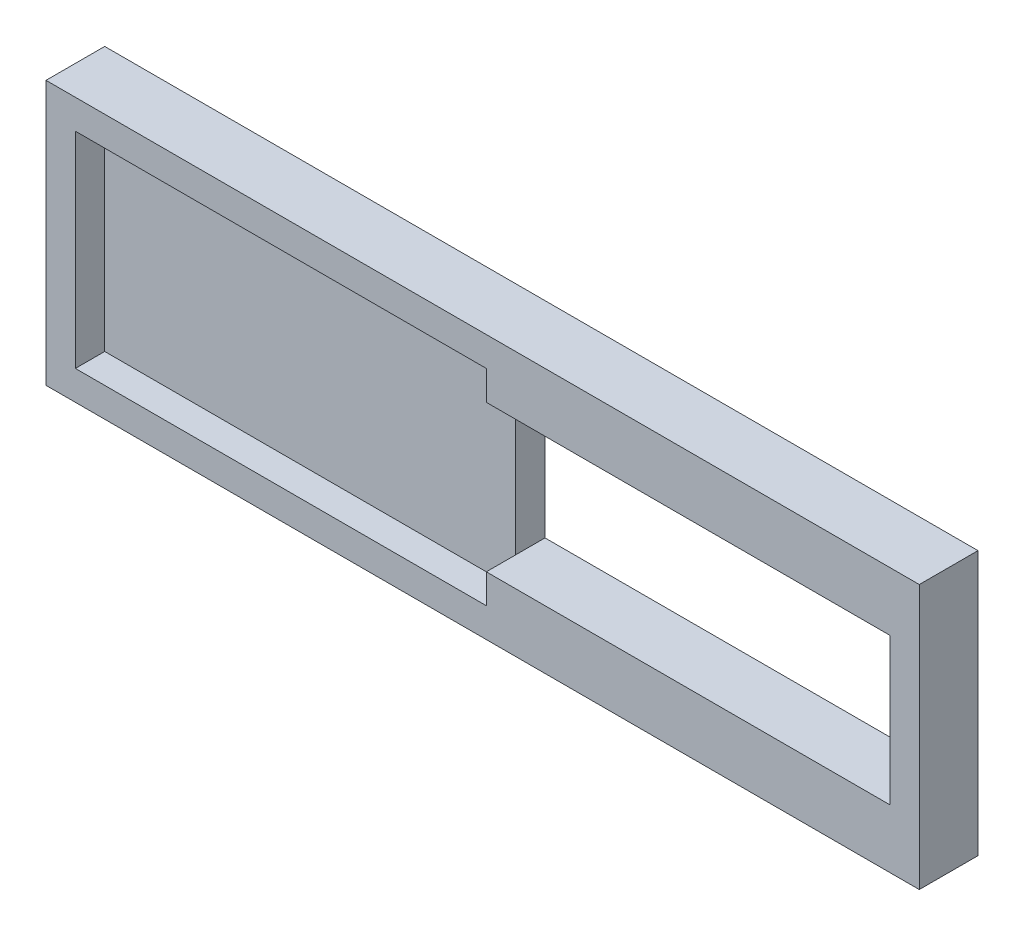
ISO-10303-21;
HEADER;
FILE_DESCRIPTION(('STEP AP214'),'2;1');
FILE_NAME('part.step','',(''),(''),'','','');
FILE_SCHEMA(('AUTOMOTIVE_DESIGN { 1 0 10303 214 1 1 1 1 }'));
ENDSEC;
DATA;
#1=APPLICATION_CONTEXT('core data for automotive mechanical design processes');
#2=APPLICATION_PROTOCOL_DEFINITION('international standard','automotive_design',2000,#1);
#3=PRODUCT_CONTEXT('',#1,'mechanical');
#4=PRODUCT('Part','Part','',(#3));
#5=PRODUCT_RELATED_PRODUCT_CATEGORY('part','',(#4));
#6=PRODUCT_DEFINITION_FORMATION('','',#4);
#7=PRODUCT_DEFINITION_CONTEXT('part definition',#1,'design');
#8=PRODUCT_DEFINITION('design','',#6,#7);
#9=PRODUCT_DEFINITION_SHAPE('','',#8);
#10=(LENGTH_UNIT() NAMED_UNIT(*) SI_UNIT(.MILLI.,.METRE.));
#11=(NAMED_UNIT(*) PLANE_ANGLE_UNIT() SI_UNIT($,.RADIAN.));
#12=(NAMED_UNIT(*) SI_UNIT($,.STERADIAN.) SOLID_ANGLE_UNIT());
#13=UNCERTAINTY_MEASURE_WITH_UNIT(LENGTH_MEASURE(1.E-05),#10,'distance_accuracy_value','');
#14=(GEOMETRIC_REPRESENTATION_CONTEXT(3) GLOBAL_UNCERTAINTY_ASSIGNED_CONTEXT((#13)) GLOBAL_UNIT_ASSIGNED_CONTEXT((#10,
#11,#12)) REPRESENTATION_CONTEXT('',''));
#15=CARTESIAN_POINT('',(0.,0.,0.));
#16=DIRECTION('',(0.,0.,1.));
#17=DIRECTION('',(1.,0.,0.));
#18=AXIS2_PLACEMENT_3D('',#15,#16,#17);
#19=CARTESIAN_POINT('',(0.,0.,5.08));
#20=DIRECTION('',(0.,0.,-1.));
#21=DIRECTION('',(-1.,0.,0.));
#22=AXIS2_PLACEMENT_3D('',#19,#20,#21);
#23=PLANE('',#22);
#24=DIRECTION('',(0.,1.,0.));
#25=VECTOR('',#24,1.);
#26=CARTESIAN_POINT('',(37.7825,-11.43,5.08));
#27=LINE('',#26,#25);
#28=CARTESIAN_POINT('',(37.7825,-11.43,5.08));
#29=VERTEX_POINT('',#28);
#30=CARTESIAN_POINT('',(37.7825,11.43,5.08));
#31=VERTEX_POINT('',#30);
#32=EDGE_CURVE('E202',#29,#31,#27,.T.);
#33=ORIENTED_EDGE('',*,*,#32,.T.);
#34=DIRECTION('',(-1.,0.,0.));
#35=VECTOR('',#34,1.);
#36=CARTESIAN_POINT('',(-37.7825,11.43,5.08));
#37=LINE('',#36,#35);
#38=CARTESIAN_POINT('',(-37.7825,11.43,5.08));
#39=VERTEX_POINT('',#38);
#40=EDGE_CURVE('E205',#31,#39,#37,.T.);
#41=ORIENTED_EDGE('',*,*,#40,.T.);
#42=DIRECTION('',(0.,-1.,0.));
#43=VECTOR('',#42,1.);
#44=CARTESIAN_POINT('',(-37.7825,-11.43,5.08));
#45=LINE('',#44,#43);
#46=CARTESIAN_POINT('',(-37.7825,-11.43,5.08));
#47=VERTEX_POINT('',#46);
#48=EDGE_CURVE('E208',#39,#47,#45,.T.);
#49=ORIENTED_EDGE('',*,*,#48,.T.);
#50=DIRECTION('',(1.,0.,0.));
#51=VECTOR('',#50,1.);
#52=CARTESIAN_POINT('',(-37.7825,-11.43,5.08));
#53=LINE('',#52,#51);
#54=EDGE_CURVE('E210',#47,#29,#53,.T.);
#55=ORIENTED_EDGE('',*,*,#54,.T.);
#56=EDGE_LOOP('',(#33,#41,#49,#55));
#57=FACE_BOUND('',#56,.T.);
#58=DIRECTION('',(-1.,0.,0.));
#59=VECTOR('',#58,1.);
#60=CARTESIAN_POINT('',(35.2425,-6.35,5.08));
#61=LINE('',#60,#59);
#62=CARTESIAN_POINT('',(35.2425,-6.35,5.08));
#63=VERTEX_POINT('',#62);
#64=CARTESIAN_POINT('',(0.317500000000012,-6.35,5.08));
#65=VERTEX_POINT('',#64);
#66=EDGE_CURVE('E147',#63,#65,#61,.T.);
#67=ORIENTED_EDGE('',*,*,#66,.T.);
#68=DIRECTION('',(0.,1.,0.));
#69=VECTOR('',#68,1.);
#70=CARTESIAN_POINT('',(0.317499999999998,8.89,5.08));
#71=LINE('',#70,#69);
#72=CARTESIAN_POINT('',(0.317499999999998,-8.89,5.08));
#73=VERTEX_POINT('',#72);
#74=EDGE_CURVE('E187',#73,#65,#71,.T.);
#75=ORIENTED_EDGE('',*,*,#74,.F.);
#76=DIRECTION('',(1.,0.,0.));
#77=VECTOR('',#76,1.);
#78=CARTESIAN_POINT('',(-35.2425,-8.89,5.08));
#79=LINE('',#78,#77);
#80=CARTESIAN_POINT('',(-35.2425,-8.89,5.08));
#81=VERTEX_POINT('',#80);
#82=EDGE_CURVE('E183',#81,#73,#79,.T.);
#83=ORIENTED_EDGE('',*,*,#82,.F.);
#84=DIRECTION('',(0.,-1.,0.));
#85=VECTOR('',#84,1.);
#86=CARTESIAN_POINT('',(-35.2425,8.89,5.08));
#87=LINE('',#86,#85);
#88=CARTESIAN_POINT('',(-35.2425,8.89,5.08));
#89=VERTEX_POINT('',#88);
#90=EDGE_CURVE('E148',#89,#81,#87,.T.);
#91=ORIENTED_EDGE('',*,*,#90,.F.);
#92=DIRECTION('',(-1.,0.,0.));
#93=VECTOR('',#92,1.);
#94=CARTESIAN_POINT('',(-35.2425,8.89,5.08));
#95=LINE('',#94,#93);
#96=CARTESIAN_POINT('',(0.317499999999998,8.89,5.08));
#97=VERTEX_POINT('',#96);
#98=EDGE_CURVE('E170',#97,#89,#95,.T.);
#99=ORIENTED_EDGE('',*,*,#98,.F.);
#100=CARTESIAN_POINT('',(0.317500000000012,6.35,5.08));
#101=VERTEX_POINT('',#100);
#102=EDGE_CURVE('E186',#101,#97,#71,.T.);
#103=ORIENTED_EDGE('',*,*,#102,.F.);
#104=DIRECTION('',(-1.,0.,0.));
#105=VECTOR('',#104,1.);
#106=CARTESIAN_POINT('',(35.2425,6.35,5.08));
#107=LINE('',#106,#105);
#108=CARTESIAN_POINT('',(35.2425,6.35,5.08));
#109=VERTEX_POINT('',#108);
#110=EDGE_CURVE('E141',#109,#101,#107,.T.);
#111=ORIENTED_EDGE('',*,*,#110,.F.);
#112=DIRECTION('',(0.,-1.,0.));
#113=VECTOR('',#112,1.);
#114=CARTESIAN_POINT('',(35.2425,6.35,5.08));
#115=LINE('',#114,#113);
#116=EDGE_CURVE('E157',#109,#63,#115,.T.);
#117=ORIENTED_EDGE('',*,*,#116,.T.);
#118=EDGE_LOOP('',(#67,#75,#83,#91,#99,#103,#111,#117));
#119=FACE_BOUND('',#118,.T.);
#120=ADVANCED_FACE('F35',(#57,#119),#23,.F.);
#121=CARTESIAN_POINT('',(0.,0.,0.));
#122=DIRECTION('',(0.,0.,-1.));
#123=DIRECTION('',(-1.,0.,0.));
#124=AXIS2_PLACEMENT_3D('',#121,#122,#123);
#125=PLANE('',#124);
#126=DIRECTION('',(0.,1.,0.));
#127=VECTOR('',#126,1.);
#128=CARTESIAN_POINT('',(37.7825,-11.43,0.));
#129=LINE('',#128,#127);
#130=CARTESIAN_POINT('',(37.7825,-11.43,0.));
#131=VERTEX_POINT('',#130);
#132=CARTESIAN_POINT('',(37.7825,11.43,0.));
#133=VERTEX_POINT('',#132);
#134=EDGE_CURVE('E194',#131,#133,#129,.T.);
#135=ORIENTED_EDGE('',*,*,#134,.F.);
#136=DIRECTION('',(1.,0.,0.));
#137=VECTOR('',#136,1.);
#138=CARTESIAN_POINT('',(-37.7825,-11.43,0.));
#139=LINE('',#138,#137);
#140=CARTESIAN_POINT('',(-37.7825,-11.43,0.));
#141=VERTEX_POINT('',#140);
#142=EDGE_CURVE('E206',#141,#131,#139,.T.);
#143=ORIENTED_EDGE('',*,*,#142,.F.);
#144=DIRECTION('',(0.,-1.,0.));
#145=VECTOR('',#144,1.);
#146=CARTESIAN_POINT('',(-37.7825,-11.43,0.));
#147=LINE('',#146,#145);
#148=CARTESIAN_POINT('',(-37.7825,11.43,0.));
#149=VERTEX_POINT('',#148);
#150=EDGE_CURVE('E217',#149,#141,#147,.T.);
#151=ORIENTED_EDGE('',*,*,#150,.F.);
#152=DIRECTION('',(-1.,0.,0.));
#153=VECTOR('',#152,1.);
#154=CARTESIAN_POINT('',(-37.7825,11.43,0.));
#155=LINE('',#154,#153);
#156=EDGE_CURVE('E215',#133,#149,#155,.T.);
#157=ORIENTED_EDGE('',*,*,#156,.F.);
#158=EDGE_LOOP('',(#135,#143,#151,#157));
#159=FACE_BOUND('',#158,.T.);
#160=DIRECTION('',(-1.,0.,0.));
#161=VECTOR('',#160,1.);
#162=CARTESIAN_POINT('',(35.2425,-6.35,0.));
#163=LINE('',#162,#161);
#164=CARTESIAN_POINT('',(35.2425,-6.35,0.));
#165=VERTEX_POINT('',#164);
#166=CARTESIAN_POINT('',(0.317500000000012,-6.35,0.));
#167=VERTEX_POINT('',#166);
#168=EDGE_CURVE('E140',#165,#167,#163,.T.);
#169=ORIENTED_EDGE('',*,*,#168,.F.);
#170=DIRECTION('',(0.,-1.,0.));
#171=VECTOR('',#170,1.);
#172=CARTESIAN_POINT('',(35.2425,6.35,0.));
#173=LINE('',#172,#171);
#174=CARTESIAN_POINT('',(35.2425,6.35,0.));
#175=VERTEX_POINT('',#174);
#176=EDGE_CURVE('E129',#175,#165,#173,.T.);
#177=ORIENTED_EDGE('',*,*,#176,.F.);
#178=DIRECTION('',(-1.,0.,0.));
#179=VECTOR('',#178,1.);
#180=CARTESIAN_POINT('',(35.2425,6.35,0.));
#181=LINE('',#180,#179);
#182=CARTESIAN_POINT('',(0.317500000000012,6.35,0.));
#183=VERTEX_POINT('',#182);
#184=EDGE_CURVE('E153',#175,#183,#181,.T.);
#185=ORIENTED_EDGE('',*,*,#184,.T.);
#186=DIRECTION('',(0.,-1.,0.));
#187=VECTOR('',#186,1.);
#188=CARTESIAN_POINT('',(0.317500000000012,6.35,0.));
#189=LINE('',#188,#187);
#190=EDGE_CURVE('E50',#183,#167,#189,.T.);
#191=ORIENTED_EDGE('',*,*,#190,.T.);
#192=EDGE_LOOP('',(#169,#177,#185,#191));
#193=FACE_BOUND('',#192,.T.);
#194=ADVANCED_FACE('F151',(#159,#193),#125,.T.);
#195=CARTESIAN_POINT('',(0.317499999999998,8.89,2.54));
#196=DIRECTION('',(1.,0.,0.));
#197=DIRECTION('',(0.,0.,-1.));
#198=AXIS2_PLACEMENT_3D('',#195,#196,#197);
#199=PLANE('',#198);
#200=DIRECTION('',(0.,0.,1.));
#201=VECTOR('',#200,1.);
#202=CARTESIAN_POINT('',(0.317500000000012,-6.35,0.));
#203=LINE('',#202,#201);
#204=CARTESIAN_POINT('',(0.317500000000012,-6.35,2.54));
#205=VERTEX_POINT('',#204);
#206=EDGE_CURVE('E164',#205,#65,#203,.T.);
#207=ORIENTED_EDGE('',*,*,#206,.F.);
#208=DIRECTION('',(0.,1.,0.));
#209=VECTOR('',#208,1.);
#210=CARTESIAN_POINT('',(0.317499999999998,8.89,2.54));
#211=LINE('',#210,#209);
#212=CARTESIAN_POINT('',(0.317499999999998,-8.89,2.54));
#213=VERTEX_POINT('',#212);
#214=EDGE_CURVE('E174',#213,#205,#211,.T.);
#215=ORIENTED_EDGE('',*,*,#214,.F.);
#216=DIRECTION('',(0.,0.,1.));
#217=VECTOR('',#216,1.);
#218=CARTESIAN_POINT('',(0.317499999999998,-8.89,2.54));
#219=LINE('',#218,#217);
#220=EDGE_CURVE('E198',#213,#73,#219,.T.);
#221=ORIENTED_EDGE('',*,*,#220,.T.);
#222=ORIENTED_EDGE('',*,*,#74,.T.);
#223=EDGE_LOOP('',(#207,#215,#221,#222));
#224=FACE_BOUND('',#223,.T.);
#225=ADVANCED_FACE('F251',(#224),#199,.F.);
#226=CARTESIAN_POINT('',(37.7825,-11.43,5.08));
#227=DIRECTION('',(-1.,0.,0.));
#228=DIRECTION('',(0.,0.,1.));
#229=AXIS2_PLACEMENT_3D('',#226,#227,#228);
#230=PLANE('',#229);
#231=ORIENTED_EDGE('',*,*,#134,.T.);
#232=DIRECTION('',(0.,0.,-1.));
#233=VECTOR('',#232,1.);
#234=CARTESIAN_POINT('',(37.7825,11.43,5.08));
#235=LINE('',#234,#233);
#236=EDGE_CURVE('E11',#31,#133,#235,.T.);
#237=ORIENTED_EDGE('',*,*,#236,.F.);
#238=ORIENTED_EDGE('',*,*,#32,.F.);
#239=DIRECTION('',(0.,0.,-1.));
#240=VECTOR('',#239,1.);
#241=CARTESIAN_POINT('',(37.7825,-11.43,5.08));
#242=LINE('',#241,#240);
#243=EDGE_CURVE('E212',#29,#131,#242,.T.);
#244=ORIENTED_EDGE('',*,*,#243,.T.);
#245=EDGE_LOOP('',(#231,#237,#238,#244));
#246=FACE_BOUND('',#245,.T.);
#247=ADVANCED_FACE('F37',(#246),#230,.F.);
#248=CARTESIAN_POINT('',(-37.7825,11.43,5.08));
#249=DIRECTION('',(0.,-1.,0.));
#250=DIRECTION('',(0.,0.,-1.));
#251=AXIS2_PLACEMENT_3D('',#248,#249,#250);
#252=PLANE('',#251);
#253=ORIENTED_EDGE('',*,*,#156,.T.);
#254=DIRECTION('',(0.,0.,-1.));
#255=VECTOR('',#254,1.);
#256=CARTESIAN_POINT('',(-37.7825,11.43,5.08));
#257=LINE('',#256,#255);
#258=EDGE_CURVE('E43',#39,#149,#257,.T.);
#259=ORIENTED_EDGE('',*,*,#258,.F.);
#260=ORIENTED_EDGE('',*,*,#40,.F.);
#261=ORIENTED_EDGE('',*,*,#236,.T.);
#262=EDGE_LOOP('',(#253,#259,#260,#261));
#263=FACE_BOUND('',#262,.T.);
#264=ADVANCED_FACE('F244',(#263),#252,.F.);
#265=CARTESIAN_POINT('',(-37.7825,-11.43,5.08));
#266=DIRECTION('',(1.,0.,0.));
#267=DIRECTION('',(0.,0.,-1.));
#268=AXIS2_PLACEMENT_3D('',#265,#266,#267);
#269=PLANE('',#268);
#270=ORIENTED_EDGE('',*,*,#150,.T.);
#271=DIRECTION('',(0.,0.,-1.));
#272=VECTOR('',#271,1.);
#273=CARTESIAN_POINT('',(-37.7825,-11.43,5.08));
#274=LINE('',#273,#272);
#275=EDGE_CURVE('E222',#47,#141,#274,.T.);
#276=ORIENTED_EDGE('',*,*,#275,.F.);
#277=ORIENTED_EDGE('',*,*,#48,.F.);
#278=ORIENTED_EDGE('',*,*,#258,.T.);
#279=EDGE_LOOP('',(#270,#276,#277,#278));
#280=FACE_BOUND('',#279,.T.);
#281=ADVANCED_FACE('F229',(#280),#269,.F.);
#282=CARTESIAN_POINT('',(-37.7825,-11.43,5.08));
#283=DIRECTION('',(0.,1.,0.));
#284=DIRECTION('',(0.,0.,1.));
#285=AXIS2_PLACEMENT_3D('',#282,#283,#284);
#286=PLANE('',#285);
#287=ORIENTED_EDGE('',*,*,#142,.T.);
#288=ORIENTED_EDGE('',*,*,#243,.F.);
#289=ORIENTED_EDGE('',*,*,#54,.F.);
#290=ORIENTED_EDGE('',*,*,#275,.T.);
#291=EDGE_LOOP('',(#287,#288,#289,#290));
#292=FACE_BOUND('',#291,.T.);
#293=ADVANCED_FACE('F237',(#292),#286,.F.);
#294=CARTESIAN_POINT('',(-35.2425,8.89,2.54));
#295=DIRECTION('',(-1.,0.,0.));
#296=DIRECTION('',(0.,0.,1.));
#297=AXIS2_PLACEMENT_3D('',#294,#295,#296);
#298=PLANE('',#297);
#299=ORIENTED_EDGE('',*,*,#90,.T.);
#300=DIRECTION('',(0.,0.,1.));
#301=VECTOR('',#300,1.);
#302=CARTESIAN_POINT('',(-35.2425,-8.89,2.54));
#303=LINE('',#302,#301);
#304=CARTESIAN_POINT('',(-35.2425,-8.89,2.54));
#305=VERTEX_POINT('',#304);
#306=EDGE_CURVE('E181',#305,#81,#303,.T.);
#307=ORIENTED_EDGE('',*,*,#306,.F.);
#308=DIRECTION('',(0.,-1.,0.));
#309=VECTOR('',#308,1.);
#310=CARTESIAN_POINT('',(-35.2425,8.89,2.54));
#311=LINE('',#310,#309);
#312=CARTESIAN_POINT('',(-35.2425,8.89,2.54));
#313=VERTEX_POINT('',#312);
#314=EDGE_CURVE('E166',#313,#305,#311,.T.);
#315=ORIENTED_EDGE('',*,*,#314,.F.);
#316=DIRECTION('',(0.,0.,1.));
#317=VECTOR('',#316,1.);
#318=CARTESIAN_POINT('',(-35.2425,8.89,2.54));
#319=LINE('',#318,#317);
#320=EDGE_CURVE('E192',#313,#89,#319,.T.);
#321=ORIENTED_EDGE('',*,*,#320,.T.);
#322=EDGE_LOOP('',(#299,#307,#315,#321));
#323=FACE_BOUND('',#322,.T.);
#324=ADVANCED_FACE('F259',(#323),#298,.F.);
#325=CARTESIAN_POINT('',(-35.2425,8.89,2.54));
#326=DIRECTION('',(0.,1.,0.));
#327=DIRECTION('',(0.,0.,1.));
#328=AXIS2_PLACEMENT_3D('',#325,#326,#327);
#329=PLANE('',#328);
#330=ORIENTED_EDGE('',*,*,#98,.T.);
#331=ORIENTED_EDGE('',*,*,#320,.F.);
#332=DIRECTION('',(-1.,0.,0.));
#333=VECTOR('',#332,1.);
#334=CARTESIAN_POINT('',(-35.2425,8.89,2.54));
#335=LINE('',#334,#333);
#336=CARTESIAN_POINT('',(0.317499999999998,8.89,2.54));
#337=VERTEX_POINT('',#336);
#338=EDGE_CURVE('E177',#337,#313,#335,.T.);
#339=ORIENTED_EDGE('',*,*,#338,.F.);
#340=DIRECTION('',(0.,0.,1.));
#341=VECTOR('',#340,1.);
#342=CARTESIAN_POINT('',(0.317499999999998,8.89,2.54));
#343=LINE('',#342,#341);
#344=EDGE_CURVE('E195',#337,#97,#343,.T.);
#345=ORIENTED_EDGE('',*,*,#344,.T.);
#346=EDGE_LOOP('',(#330,#331,#339,#345));
#347=FACE_BOUND('',#346,.T.);
#348=ADVANCED_FACE('F266',(#347),#329,.F.);
#349=CARTESIAN_POINT('',(0.317499999999998,6.35,2.54));
#350=VERTEX_POINT('',#349);
#351=EDGE_CURVE('E173',#350,#337,#211,.T.);
#352=ORIENTED_EDGE('',*,*,#351,.F.);
#353=DIRECTION('',(0.,0.,1.));
#354=VECTOR('',#353,1.);
#355=CARTESIAN_POINT('',(0.317500000000012,6.35,0.));
#356=LINE('',#355,#354);
#357=EDGE_CURVE('E162',#350,#101,#356,.T.);
#358=ORIENTED_EDGE('',*,*,#357,.T.);
#359=ORIENTED_EDGE('',*,*,#102,.T.);
#360=ORIENTED_EDGE('',*,*,#344,.F.);
#361=EDGE_LOOP('',(#352,#358,#359,#360));
#362=FACE_BOUND('',#361,.T.);
#363=ADVANCED_FACE('F271',(#362),#199,.F.);
#364=CARTESIAN_POINT('',(-35.2425,-8.89,2.54));
#365=DIRECTION('',(0.,-1.,0.));
#366=DIRECTION('',(0.,0.,-1.));
#367=AXIS2_PLACEMENT_3D('',#364,#365,#366);
#368=PLANE('',#367);
#369=ORIENTED_EDGE('',*,*,#82,.T.);
#370=ORIENTED_EDGE('',*,*,#220,.F.);
#371=DIRECTION('',(1.,0.,0.));
#372=VECTOR('',#371,1.);
#373=CARTESIAN_POINT('',(-35.2425,-8.89,2.54));
#374=LINE('',#373,#372);
#375=EDGE_CURVE('E169',#305,#213,#374,.T.);
#376=ORIENTED_EDGE('',*,*,#375,.F.);
#377=ORIENTED_EDGE('',*,*,#306,.T.);
#378=EDGE_LOOP('',(#369,#370,#376,#377));
#379=FACE_BOUND('',#378,.T.);
#380=ADVANCED_FACE('F280',(#379),#368,.F.);
#381=CARTESIAN_POINT('',(0.,0.,2.54));
#382=DIRECTION('',(0.,0.,1.));
#383=DIRECTION('',(1.,0.,0.));
#384=AXIS2_PLACEMENT_3D('',#381,#382,#383);
#385=PLANE('',#384);
#386=ORIENTED_EDGE('',*,*,#314,.T.);
#387=ORIENTED_EDGE('',*,*,#375,.T.);
#388=ORIENTED_EDGE('',*,*,#214,.T.);
#389=EDGE_CURVE('E178',#205,#350,#211,.T.);
#390=ORIENTED_EDGE('',*,*,#389,.T.);
#391=ORIENTED_EDGE('',*,*,#351,.T.);
#392=ORIENTED_EDGE('',*,*,#338,.T.);
#393=EDGE_LOOP('',(#386,#387,#388,#390,#391,#392));
#394=FACE_BOUND('',#393,.T.);
#395=ADVANCED_FACE('F287',(#394),#385,.T.);
#396=CARTESIAN_POINT('',(35.2425,6.35,0.));
#397=DIRECTION('',(-1.,0.,0.));
#398=DIRECTION('',(0.,0.,1.));
#399=AXIS2_PLACEMENT_3D('',#396,#397,#398);
#400=PLANE('',#399);
#401=ORIENTED_EDGE('',*,*,#116,.F.);
#402=DIRECTION('',(0.,0.,1.));
#403=VECTOR('',#402,1.);
#404=CARTESIAN_POINT('',(35.2425,6.35,0.));
#405=LINE('',#404,#403);
#406=EDGE_CURVE('E135',#175,#109,#405,.T.);
#407=ORIENTED_EDGE('',*,*,#406,.F.);
#408=ORIENTED_EDGE('',*,*,#176,.T.);
#409=DIRECTION('',(0.,0.,1.));
#410=VECTOR('',#409,1.);
#411=CARTESIAN_POINT('',(35.2425,-6.35,0.));
#412=LINE('',#411,#410);
#413=EDGE_CURVE('E133',#165,#63,#412,.T.);
#414=ORIENTED_EDGE('',*,*,#413,.T.);
#415=EDGE_LOOP('',(#401,#407,#408,#414));
#416=FACE_BOUND('',#415,.T.);
#417=ADVANCED_FACE('F132',(#416),#400,.T.);
#418=CARTESIAN_POINT('',(35.2425,-6.35,0.));
#419=DIRECTION('',(0.,1.,0.));
#420=DIRECTION('',(-1.,0.,0.));
#421=AXIS2_PLACEMENT_3D('',#418,#419,#420);
#422=PLANE('',#421);
#423=ORIENTED_EDGE('',*,*,#66,.F.);
#424=ORIENTED_EDGE('',*,*,#413,.F.);
#425=ORIENTED_EDGE('',*,*,#168,.T.);
#426=EDGE_CURVE('E149',#167,#205,#203,.T.);
#427=ORIENTED_EDGE('',*,*,#426,.T.);
#428=ORIENTED_EDGE('',*,*,#206,.T.);
#429=EDGE_LOOP('',(#423,#424,#425,#427,#428));
#430=FACE_BOUND('',#429,.T.);
#431=ADVANCED_FACE('F144',(#430),#422,.T.);
#432=CARTESIAN_POINT('',(0.317500000000012,6.35,0.));
#433=DIRECTION('',(-1.,0.,0.));
#434=DIRECTION('',(0.,-1.,0.));
#435=AXIS2_PLACEMENT_3D('',#432,#433,#434);
#436=PLANE('',#435);
#437=ORIENTED_EDGE('',*,*,#389,.F.);
#438=ORIENTED_EDGE('',*,*,#426,.F.);
#439=ORIENTED_EDGE('',*,*,#190,.F.);
#440=EDGE_CURVE('E54',#183,#350,#356,.T.);
#441=ORIENTED_EDGE('',*,*,#440,.T.);
#442=EDGE_LOOP('',(#437,#438,#439,#441));
#443=FACE_BOUND('',#442,.T.);
#444=ADVANCED_FACE('F298',(#443),#436,.F.);
#445=CARTESIAN_POINT('',(35.2425,6.35,0.));
#446=DIRECTION('',(0.,1.,0.));
#447=DIRECTION('',(-1.,0.,0.));
#448=AXIS2_PLACEMENT_3D('',#445,#446,#447);
#449=PLANE('',#448);
#450=ORIENTED_EDGE('',*,*,#110,.T.);
#451=ORIENTED_EDGE('',*,*,#357,.F.);
#452=ORIENTED_EDGE('',*,*,#440,.F.);
#453=ORIENTED_EDGE('',*,*,#184,.F.);
#454=ORIENTED_EDGE('',*,*,#406,.T.);
#455=EDGE_LOOP('',(#450,#451,#452,#453,#454));
#456=FACE_BOUND('',#455,.T.);
#457=ADVANCED_FACE('F296',(#456),#449,.F.);
#458=CLOSED_SHELL('',(#120,#194,#225,#247,#264,#281,#293,#324,#348,#363,#380,#395,#417,#431,
#444,#457));
#459=MANIFOLD_SOLID_BREP('B2',#458);
#460=ADVANCED_BREP_SHAPE_REPRESENTATION('',(#18,#459),#14);
#461=SHAPE_DEFINITION_REPRESENTATION(#9,#460);
ENDSEC;
END-ISO-10303-21;
